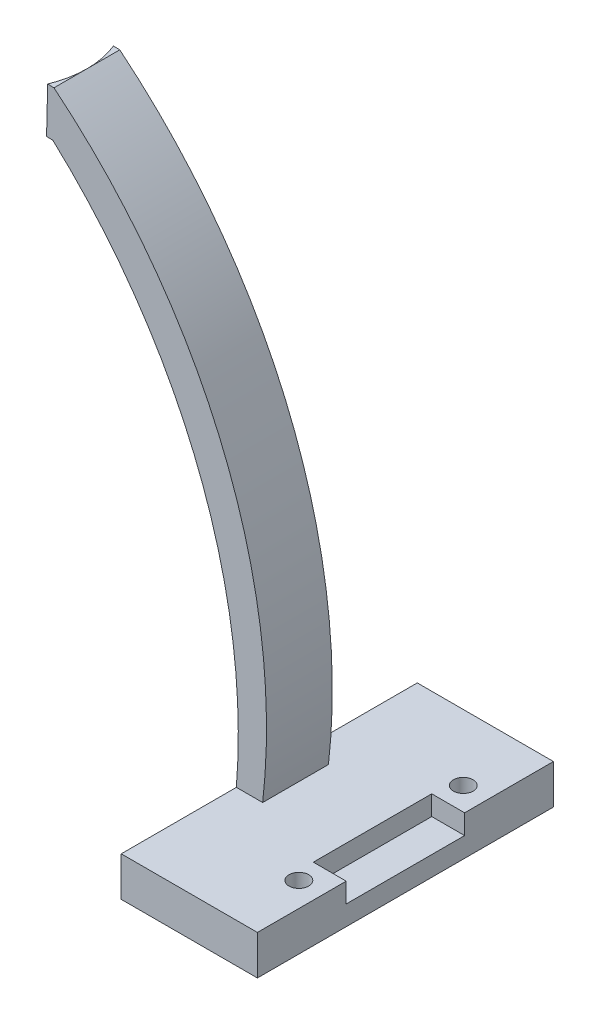
ISO-10303-21;
HEADER;
FILE_DESCRIPTION(('STEP AP214'),'2;1');
FILE_NAME('part.step','',(''),(''),'','','');
FILE_SCHEMA(('AUTOMOTIVE_DESIGN { 1 0 10303 214 1 1 1 1 }'));
ENDSEC;
DATA;
#1=APPLICATION_CONTEXT('core data for automotive mechanical design processes');
#2=APPLICATION_PROTOCOL_DEFINITION('international standard','automotive_design',2000,#1);
#3=PRODUCT_CONTEXT('',#1,'mechanical');
#4=PRODUCT('Part','Part','',(#3));
#5=PRODUCT_RELATED_PRODUCT_CATEGORY('part','',(#4));
#6=PRODUCT_DEFINITION_FORMATION('','',#4);
#7=PRODUCT_DEFINITION_CONTEXT('part definition',#1,'design');
#8=PRODUCT_DEFINITION('design','',#6,#7);
#9=PRODUCT_DEFINITION_SHAPE('','',#8);
#10=(LENGTH_UNIT() NAMED_UNIT(*) SI_UNIT(.MILLI.,.METRE.));
#11=(NAMED_UNIT(*) PLANE_ANGLE_UNIT() SI_UNIT($,.RADIAN.));
#12=(NAMED_UNIT(*) SI_UNIT($,.STERADIAN.) SOLID_ANGLE_UNIT());
#13=UNCERTAINTY_MEASURE_WITH_UNIT(LENGTH_MEASURE(1.E-05),#10,'distance_accuracy_value','');
#14=(GEOMETRIC_REPRESENTATION_CONTEXT(3) GLOBAL_UNCERTAINTY_ASSIGNED_CONTEXT((#13)) GLOBAL_UNIT_ASSIGNED_CONTEXT((#10,
#11,#12)) REPRESENTATION_CONTEXT('',''));
#15=CARTESIAN_POINT('',(0.,0.,0.));
#16=DIRECTION('',(0.,0.,1.));
#17=DIRECTION('',(1.,0.,0.));
#18=AXIS2_PLACEMENT_3D('',#15,#16,#17);
#19=CARTESIAN_POINT('',(-1.12144603022671,84.9599994250838,69.1592739234495));
#20=DIRECTION('',(0.999712398671277,-0.0239816584689477,0.));
#21=DIRECTION('',(0.0239816584689477,0.999712398671277,0.));
#22=AXIS2_PLACEMENT_3D('',#19,#20,#21);
#23=PLANE('',#22);
#24=DIRECTION('',(0.,0.,1.));
#25=VECTOR('',#24,1.);
#26=CARTESIAN_POINT('',(-1.28931763950938,77.9620126343849,59.1592739234495));
#27=LINE('',#26,#25);
#28=CARTESIAN_POINT('',(-1.28931763950934,77.9620126343849,59.1592739234495));
#29=VERTEX_POINT('',#28);
#30=CARTESIAN_POINT('',(-1.28931763950938,77.9620126343849,64.1592739234495));
#31=VERTEX_POINT('',#30);
#32=EDGE_CURVE('P0_E32',#29,#31,#27,.T.);
#33=ORIENTED_EDGE('',*,*,#32,.F.);
#34=DIRECTION('',(-0.0239816584689477,-0.999712398671277,0.));
#35=VECTOR('',#34,1.);
#36=CARTESIAN_POINT('',(-1.12144603022671,84.9599994250838,59.1592739234495));
#37=LINE('',#36,#35);
#38=CARTESIAN_POINT('',(-1.28936593349665,77.9599994250838,59.1592739234495));
#39=VERTEX_POINT('',#38);
#40=EDGE_CURVE('P0_E136',#29,#39,#37,.T.);
#41=ORIENTED_EDGE('',*,*,#40,.T.);
#42=DIRECTION('',(0.,0.,-1.));
#43=VECTOR('',#42,1.);
#44=CARTESIAN_POINT('',(-1.28936593349665,77.9599994250838,69.1592739234495));
#45=LINE('',#44,#43);
#46=CARTESIAN_POINT('',(-1.28936593349665,77.9599994250838,69.1592739234495));
#47=VERTEX_POINT('',#46);
#48=EDGE_CURVE('P0_E25',#47,#39,#45,.T.);
#49=ORIENTED_EDGE('',*,*,#48,.F.);
#50=DIRECTION('',(-0.0239816584689477,-0.999712398671277,0.));
#51=VECTOR('',#50,1.);
#52=CARTESIAN_POINT('',(-1.12144603022671,84.9599994250838,69.1592739234495));
#53=LINE('',#52,#51);
#54=CARTESIAN_POINT('',(-1.28931763950934,77.9620126343849,69.1592739234495));
#55=VERTEX_POINT('',#54);
#56=EDGE_CURVE('P0_E127',#55,#47,#53,.T.);
#57=ORIENTED_EDGE('',*,*,#56,.F.);
#58=DIRECTION('',(0.,0.,-1.));
#59=VECTOR('',#58,1.);
#60=CARTESIAN_POINT('',(-1.28931763950938,77.9620126343849,59.1592739234495));
#61=LINE('',#60,#59);
#62=EDGE_CURVE('P0_E39',#55,#31,#61,.T.);
#63=ORIENTED_EDGE('',*,*,#62,.T.);
#64=EDGE_LOOP('',(#33,#41,#49,#57,#63));
#65=FACE_BOUND('',#64,.T.);
#66=ADVANCED_FACE('P0_F17',(#65),#23,.F.);
#67=CARTESIAN_POINT('',(-56.8168251448185,16.8275934402524,69.1592739234495));
#68=DIRECTION('',(0.,0.,-1.));
#69=DIRECTION('',(-1.,0.,0.));
#70=AXIS2_PLACEMENT_3D('',#67,#68,#69);
#71=CYLINDRICAL_SURFACE('',#70,88.);
#72=CARTESIAN_POINT('',(-56.8168251448185,16.8275934402524,59.1592739234495));
#73=DIRECTION('',(0.,0.,1.));
#74=DIRECTION('',(-1.,0.,0.));
#75=AXIS2_PLACEMENT_3D('',#72,#73,#74);
#76=CIRCLE('',#75,88.);
#77=CARTESIAN_POINT('',(30.6019291079437,6.7299994250838,59.1592739234495));
#78=VERTEX_POINT('',#77);
#79=CARTESIAN_POINT('',(-1.12144603022671,84.9599994250838,59.1592739234495));
#80=VERTEX_POINT('',#79);
#81=EDGE_CURVE('P0_E123',#78,#80,#76,.T.);
#82=ORIENTED_EDGE('',*,*,#81,.T.);
#83=DIRECTION('',(0.,0.,1.));
#84=VECTOR('',#83,1.);
#85=CARTESIAN_POINT('',(-1.12144603022672,84.9599994250838,59.1592739234495));
#86=LINE('',#85,#84);
#87=CARTESIAN_POINT('',(-1.12144603022672,84.9599994250838,64.1592739234495));
#88=VERTEX_POINT('',#87);
#89=EDGE_CURVE('P0_E93',#80,#88,#86,.T.);
#90=ORIENTED_EDGE('',*,*,#89,.T.);
#91=DIRECTION('',(0.,0.,-1.));
#92=VECTOR('',#91,1.);
#93=CARTESIAN_POINT('',(-1.12144603022671,84.9599994250838,69.1592739234495));
#94=LINE('',#93,#92);
#95=CARTESIAN_POINT('',(-1.12144603022672,84.9599994250838,69.1592739234495));
#96=VERTEX_POINT('',#95);
#97=EDGE_CURVE('P0_E11',#96,#88,#94,.T.);
#98=ORIENTED_EDGE('',*,*,#97,.F.);
#99=CARTESIAN_POINT('',(-56.8168251448185,16.8275934402524,69.1592739234495));
#100=DIRECTION('',(0.,0.,1.));
#101=DIRECTION('',(-1.,0.,0.));
#102=AXIS2_PLACEMENT_3D('',#99,#100,#101);
#103=CIRCLE('',#102,88.);
#104=CARTESIAN_POINT('',(30.6019291079437,6.7299994250838,69.1592739234495));
#105=VERTEX_POINT('',#104);
#106=EDGE_CURVE('P0_E124',#105,#96,#103,.T.);
#107=ORIENTED_EDGE('',*,*,#106,.F.);
#108=DIRECTION('',(0.,0.,-1.));
#109=VECTOR('',#108,1.);
#110=CARTESIAN_POINT('',(30.6019291079437,6.7299994250838,69.1592739234495));
#111=LINE('',#110,#109);
#112=EDGE_CURVE('P0_E134',#105,#78,#111,.T.);
#113=ORIENTED_EDGE('',*,*,#112,.T.);
#114=EDGE_LOOP('',(#82,#90,#98,#107,#113));
#115=FACE_BOUND('',#114,.T.);
#116=ADVANCED_FACE('P0_F19',(#115),#71,.T.);
#117=CARTESIAN_POINT('',(-60.1059268398833,13.8537426076303,69.1592739234495));
#118=DIRECTION('',(0.,0.,-1.));
#119=DIRECTION('',(-1.,0.,0.));
#120=AXIS2_PLACEMENT_3D('',#117,#118,#119);
#121=CYLINDRICAL_SURFACE('',#120,87.);
#122=CARTESIAN_POINT('',(-60.1059268398833,13.8537426076303,59.1592739234495));
#123=DIRECTION('',(0.,0.,-1.));
#124=DIRECTION('',(-1.,0.,0.));
#125=AXIS2_PLACEMENT_3D('',#122,#123,#124);
#126=CIRCLE('',#125,87.);
#127=CARTESIAN_POINT('',(26.6019291079437,6.72999942508381,59.1592739234495));
#128=VERTEX_POINT('',#127);
#129=EDGE_CURVE('P0_E138',#39,#128,#126,.T.);
#130=ORIENTED_EDGE('',*,*,#129,.T.);
#131=DIRECTION('',(0.,0.,-1.));
#132=VECTOR('',#131,1.);
#133=CARTESIAN_POINT('',(26.6019291079437,6.72999942508381,69.1592739234495));
#134=LINE('',#133,#132);
#135=CARTESIAN_POINT('',(26.6019291079437,6.72999942508381,69.1592739234495));
#136=VERTEX_POINT('',#135);
#137=EDGE_CURVE('P0_E143',#136,#128,#134,.T.);
#138=ORIENTED_EDGE('',*,*,#137,.F.);
#139=CARTESIAN_POINT('',(-60.1059268398833,13.8537426076303,69.1592739234495));
#140=DIRECTION('',(0.,0.,-1.));
#141=DIRECTION('',(-1.,0.,0.));
#142=AXIS2_PLACEMENT_3D('',#139,#140,#141);
#143=CIRCLE('',#142,87.);
#144=EDGE_CURVE('P0_E130',#47,#136,#143,.T.);
#145=ORIENTED_EDGE('',*,*,#144,.F.);
#146=ORIENTED_EDGE('',*,*,#48,.T.);
#147=EDGE_LOOP('',(#130,#138,#145,#146));
#148=FACE_BOUND('',#147,.T.);
#149=ADVANCED_FACE('P0_F150',(#148),#121,.F.);
#150=CARTESIAN_POINT('',(26.6019291079437,6.7299994250838,69.1592739234495));
#151=DIRECTION('',(0.,1.,0.));
#152=DIRECTION('',(0.,0.,1.));
#153=AXIS2_PLACEMENT_3D('',#150,#151,#152);
#154=PLANE('',#153);
#155=DIRECTION('',(1.,0.,0.));
#156=VECTOR('',#155,1.);
#157=CARTESIAN_POINT('',(26.6019291079437,6.7299994250838,59.1592739234495));
#158=LINE('',#157,#156);
#159=EDGE_CURVE('P0_E128',#128,#78,#158,.T.);
#160=ORIENTED_EDGE('',*,*,#159,.T.);
#161=ORIENTED_EDGE('',*,*,#112,.F.);
#162=DIRECTION('',(1.,0.,0.));
#163=VECTOR('',#162,1.);
#164=CARTESIAN_POINT('',(26.6019291079437,6.7299994250838,69.1592739234495));
#165=LINE('',#164,#163);
#166=EDGE_CURVE('P0_E132',#136,#105,#165,.T.);
#167=ORIENTED_EDGE('',*,*,#166,.F.);
#168=ORIENTED_EDGE('',*,*,#137,.T.);
#169=EDGE_LOOP('',(#160,#161,#167,#168));
#170=FACE_BOUND('',#169,.T.);
#171=ADVANCED_FACE('P0_F156',(#170),#154,.F.);
#172=CARTESIAN_POINT('',(-56.8168251448185,16.8275934402524,69.1592739234495));
#173=DIRECTION('',(0.,0.,-1.));
#174=DIRECTION('',(-1.,0.,0.));
#175=AXIS2_PLACEMENT_3D('',#172,#173,#174);
#176=PLANE('',#175);
#177=ORIENTED_EDGE('',*,*,#106,.T.);
#178=DIRECTION('',(-0.999712398671277,0.023981658468951,0.));
#179=VECTOR('',#178,1.);
#180=CARTESIAN_POINT('',(18.4263968889922,84.4910748690651,69.1592739234495));
#181=LINE('',#180,#179);
#182=CARTESIAN_POINT('',(-2.08123371061888,84.9830233471483,69.1592739234495));
#183=VERTEX_POINT('',#182);
#184=EDGE_CURVE('P0_E107',#96,#183,#181,.T.);
#185=ORIENTED_EDGE('',*,*,#184,.T.);
#186=DIRECTION('',(0.0239816584689512,0.999712398671277,0.));
#187=VECTOR('',#186,1.);
#188=CARTESIAN_POINT('',(-2.24910531990154,77.9850365564494,69.1592739234495));
#189=LINE('',#188,#187);
#190=CARTESIAN_POINT('',(-2.24910531990154,77.9850365564494,69.1592739234495));
#191=VERTEX_POINT('',#190);
#192=EDGE_CURVE('P0_E119',#191,#183,#189,.T.);
#193=ORIENTED_EDGE('',*,*,#192,.F.);
#194=DIRECTION('',(-0.999712398671277,0.023981658468951,0.));
#195=VECTOR('',#194,1.);
#196=CARTESIAN_POINT('',(18.2585252797096,77.4930880783661,69.1592739234495));
#197=LINE('',#196,#195);
#198=EDGE_CURVE('P0_E117',#55,#191,#197,.T.);
#199=ORIENTED_EDGE('',*,*,#198,.F.);
#200=ORIENTED_EDGE('',*,*,#56,.T.);
#201=ORIENTED_EDGE('',*,*,#144,.T.);
#202=ORIENTED_EDGE('',*,*,#166,.T.);
#203=EDGE_LOOP('',(#177,#185,#193,#199,#200,#201,#202));
#204=FACE_BOUND('',#203,.T.);
#205=ADVANCED_FACE('P0_F162',(#204),#176,.F.);
#206=CARTESIAN_POINT('',(-56.8168251448185,16.8275934402524,59.1592739234495));
#207=DIRECTION('',(0.,0.,-1.));
#208=DIRECTION('',(-1.,0.,0.));
#209=AXIS2_PLACEMENT_3D('',#206,#207,#208);
#210=PLANE('',#209);
#211=ORIENTED_EDGE('',*,*,#81,.F.);
#212=ORIENTED_EDGE('',*,*,#159,.F.);
#213=ORIENTED_EDGE('',*,*,#129,.F.);
#214=ORIENTED_EDGE('',*,*,#40,.F.);
#215=DIRECTION('',(-0.999712398671277,0.023981658468951,0.));
#216=VECTOR('',#215,1.);
#217=CARTESIAN_POINT('',(18.2585252797096,77.4930880783661,59.1592739234495));
#218=LINE('',#217,#216);
#219=CARTESIAN_POINT('',(-2.24910531990154,77.9850365564493,59.1592739234495));
#220=VERTEX_POINT('',#219);
#221=EDGE_CURVE('P0_E90',#29,#220,#218,.T.);
#222=ORIENTED_EDGE('',*,*,#221,.T.);
#223=DIRECTION('',(0.0239816584689512,0.999712398671277,0.));
#224=VECTOR('',#223,1.);
#225=CARTESIAN_POINT('',(-2.24910531990154,77.9850365564493,59.1592739234495));
#226=LINE('',#225,#224);
#227=CARTESIAN_POINT('',(-2.08123371061888,84.9830233471483,59.1592739234495));
#228=VERTEX_POINT('',#227);
#229=EDGE_CURVE('P0_E83',#220,#228,#226,.T.);
#230=ORIENTED_EDGE('',*,*,#229,.T.);
#231=DIRECTION('',(-0.999712398671277,0.023981658468951,0.));
#232=VECTOR('',#231,1.);
#233=CARTESIAN_POINT('',(18.4263968889922,84.491074869065,59.1592739234495));
#234=LINE('',#233,#232);
#235=EDGE_CURVE('P0_E88',#80,#228,#234,.T.);
#236=ORIENTED_EDGE('',*,*,#235,.F.);
#237=EDGE_LOOP('',(#211,#212,#213,#214,#222,#230,#236));
#238=FACE_BOUND('',#237,.T.);
#239=ADVANCED_FACE('P0_F86',(#238),#210,.T.);
#240=CARTESIAN_POINT('',(-14.7854350215716,78.2857650237157,64.1592739234495));
#241=DIRECTION('',(0.0239816584689512,0.999712398671277,0.));
#242=DIRECTION('',(-0.999712398671277,0.0239816584689512,0.));
#243=AXIS2_PLACEMENT_3D('',#240,#241,#242);
#244=CYLINDRICAL_SURFACE('',#243,13.5);
#245=CARTESIAN_POINT('',(-14.617563412289,85.2837518144147,64.1592739234495));
#246=DIRECTION('',(0.023981658468951,0.999712398671277,0.));
#247=DIRECTION('',(-0.999712398671277,0.023981658468951,0.));
#248=AXIS2_PLACEMENT_3D('',#245,#246,#247);
#249=CIRCLE('',#248,13.5);
#250=EDGE_CURVE('P0_E101',#183,#88,#249,.T.);
#251=ORIENTED_EDGE('',*,*,#250,.T.);
#252=CARTESIAN_POINT('',(-14.617563412289,85.2837518144147,64.1592739234495));
#253=DIRECTION('',(0.023981658468951,0.999712398671277,0.));
#254=DIRECTION('',(-0.999712398671277,0.023981658468951,0.));
#255=AXIS2_PLACEMENT_3D('',#252,#253,#254);
#256=CIRCLE('',#255,13.5);
#257=EDGE_CURVE('P0_E97',#88,#228,#256,.T.);
#258=ORIENTED_EDGE('',*,*,#257,.T.);
#259=ORIENTED_EDGE('',*,*,#229,.F.);
#260=CARTESIAN_POINT('',(-14.7854350215716,78.2857650237157,64.1592739234495));
#261=DIRECTION('',(0.023981658468951,0.999712398671277,0.));
#262=DIRECTION('',(-0.999712398671277,0.023981658468951,0.));
#263=AXIS2_PLACEMENT_3D('',#260,#261,#262);
#264=CIRCLE('',#263,13.5);
#265=EDGE_CURVE('P0_E109',#31,#220,#264,.T.);
#266=ORIENTED_EDGE('',*,*,#265,.F.);
#267=CARTESIAN_POINT('',(-14.7854350215716,78.2857650237157,64.1592739234495));
#268=DIRECTION('',(0.023981658468951,0.999712398671277,0.));
#269=DIRECTION('',(-0.999712398671277,0.023981658468951,0.));
#270=AXIS2_PLACEMENT_3D('',#267,#268,#269);
#271=CIRCLE('',#270,13.5);
#272=EDGE_CURVE('P0_E115',#191,#31,#271,.T.);
#273=ORIENTED_EDGE('',*,*,#272,.F.);
#274=ORIENTED_EDGE('',*,*,#192,.T.);
#275=EDGE_LOOP('',(#251,#258,#259,#266,#273,#274));
#276=FACE_BOUND('',#275,.T.);
#277=ADVANCED_FACE('P0_F98',(#276),#244,.F.);
#278=CARTESIAN_POINT('',(18.2585252797096,77.4930880783661,59.1592739234495));
#279=DIRECTION('',(0.023981658468951,0.999712398671277,0.));
#280=DIRECTION('',(-0.999712398671277,0.023981658468951,0.));
#281=AXIS2_PLACEMENT_3D('',#278,#279,#280);
#282=PLANE('',#281);
#283=ORIENTED_EDGE('',*,*,#272,.T.);
#284=ORIENTED_EDGE('',*,*,#62,.F.);
#285=ORIENTED_EDGE('',*,*,#198,.T.);
#286=EDGE_LOOP('',(#283,#284,#285));
#287=FACE_BOUND('',#286,.T.);
#288=ADVANCED_FACE('P0_F167',(#287),#282,.F.);
#289=CARTESIAN_POINT('',(18.4263968889922,84.491074869065,59.1592739234495));
#290=DIRECTION('',(0.023981658468951,0.999712398671277,0.));
#291=DIRECTION('',(-0.999712398671277,0.023981658468951,0.));
#292=AXIS2_PLACEMENT_3D('',#289,#290,#291);
#293=PLANE('',#292);
#294=ORIENTED_EDGE('',*,*,#250,.F.);
#295=ORIENTED_EDGE('',*,*,#184,.F.);
#296=ORIENTED_EDGE('',*,*,#97,.T.);
#297=EDGE_LOOP('',(#294,#295,#296));
#298=FACE_BOUND('',#297,.T.);
#299=ADVANCED_FACE('P0_F169',(#298),#293,.T.);
#300=CARTESIAN_POINT('',(18.2585252797096,77.4930880783661,59.1592739234495));
#301=DIRECTION('',(0.023981658468951,0.999712398671277,0.));
#302=DIRECTION('',(-0.999712398671277,0.023981658468951,0.));
#303=AXIS2_PLACEMENT_3D('',#300,#301,#302);
#304=PLANE('',#303);
#305=ORIENTED_EDGE('',*,*,#265,.T.);
#306=ORIENTED_EDGE('',*,*,#221,.F.);
#307=ORIENTED_EDGE('',*,*,#32,.T.);
#308=EDGE_LOOP('',(#305,#306,#307));
#309=FACE_BOUND('',#308,.T.);
#310=ADVANCED_FACE('P0_F165',(#309),#304,.F.);
#311=CARTESIAN_POINT('',(18.4263968889922,84.491074869065,59.1592739234495));
#312=DIRECTION('',(0.023981658468951,0.999712398671277,0.));
#313=DIRECTION('',(-0.999712398671277,0.023981658468951,0.));
#314=AXIS2_PLACEMENT_3D('',#311,#312,#313);
#315=PLANE('',#314);
#316=ORIENTED_EDGE('',*,*,#257,.F.);
#317=ORIENTED_EDGE('',*,*,#89,.F.);
#318=ORIENTED_EDGE('',*,*,#235,.T.);
#319=EDGE_LOOP('',(#316,#317,#318));
#320=FACE_BOUND('',#319,.T.);
#321=ADVANCED_FACE('P0_F105',(#320),#315,.T.);
#322=CLOSED_SHELL('',(#66,#116,#149,#171,#205,#239,#277,#288,#299,#310,#321));
#323=MANIFOLD_SOLID_BREP('P0_B1',#322);
#324=CARTESIAN_POINT('',(35.0959219291765,6.7299994250838,60.1126597657247));
#325=DIRECTION('',(0.,1.,0.));
#326=DIRECTION('',(0.,0.,1.));
#327=AXIS2_PLACEMENT_3D('',#324,#325,#326);
#328=PLANE('',#327);
#329=DIRECTION('',(1.,0.,0.));
#330=VECTOR('',#329,1.);
#331=CARTESIAN_POINT('',(42.3019291079437,6.7299994250838,73.1592739234495));
#332=LINE('',#331,#330);
#333=CARTESIAN_POINT('',(42.3019291079437,6.7299994250838,73.1592739234495));
#334=VERTEX_POINT('',#333);
#335=CARTESIAN_POINT('',(47.3019291079437,6.7299994250838,73.1592739234495));
#336=VERTEX_POINT('',#335);
#337=EDGE_CURVE('P1_E106',#334,#336,#332,.T.);
#338=ORIENTED_EDGE('',*,*,#337,.F.);
#339=DIRECTION('',(0.,0.,1.));
#340=VECTOR('',#339,1.);
#341=CARTESIAN_POINT('',(42.3019291079437,6.7299994250838,55.1592739234495));
#342=LINE('',#341,#340);
#343=CARTESIAN_POINT('',(42.3019291079437,6.7299994250838,55.1592739234495));
#344=VERTEX_POINT('',#343);
#345=EDGE_CURVE('P1_E275',#344,#334,#342,.T.);
#346=ORIENTED_EDGE('',*,*,#345,.F.);
#347=DIRECTION('',(-1.,0.,0.));
#348=VECTOR('',#347,1.);
#349=CARTESIAN_POINT('',(47.3019291079437,6.7299994250838,55.1592739234495));
#350=LINE('',#349,#348);
#351=CARTESIAN_POINT('',(47.3019291079437,6.7299994250838,55.1592739234495));
#352=VERTEX_POINT('',#351);
#353=EDGE_CURVE('P1_E280',#352,#344,#350,.T.);
#354=ORIENTED_EDGE('',*,*,#353,.F.);
#355=DIRECTION('',(0.,0.,-1.));
#356=VECTOR('',#355,1.);
#357=CARTESIAN_POINT('',(47.3019291079437,6.7299994250838,86.6592739234495));
#358=LINE('',#357,#356);
#359=CARTESIAN_POINT('',(47.3019291079437,6.7299994250838,41.6592739234495));
#360=VERTEX_POINT('',#359);
#361=EDGE_CURVE('P1_E68',#352,#360,#358,.T.);
#362=ORIENTED_EDGE('',*,*,#361,.T.);
#363=DIRECTION('',(-1.,0.,0.));
#364=VECTOR('',#363,1.);
#365=CARTESIAN_POINT('',(47.3019291079437,6.7299994250838,41.6592739234495));
#366=LINE('',#365,#364);
#367=CARTESIAN_POINT('',(26.6019291079437,6.7299994250838,41.6592739234495));
#368=VERTEX_POINT('',#367);
#369=EDGE_CURVE('P1_E131',#360,#368,#366,.T.);
#370=ORIENTED_EDGE('',*,*,#369,.T.);
#371=DIRECTION('',(0.,0.,1.));
#372=VECTOR('',#371,1.);
#373=CARTESIAN_POINT('',(26.6019291079437,6.7299994250838,41.6592739234495));
#374=LINE('',#373,#372);
#375=CARTESIAN_POINT('',(26.6019291079437,6.7299994250838,86.6592739234495));
#376=VERTEX_POINT('',#375);
#377=EDGE_CURVE('P1_E133',#368,#376,#374,.T.);
#378=ORIENTED_EDGE('',*,*,#377,.T.);
#379=DIRECTION('',(1.,0.,0.));
#380=VECTOR('',#379,1.);
#381=CARTESIAN_POINT('',(26.6019291079437,6.7299994250838,86.6592739234495));
#382=LINE('',#381,#380);
#383=CARTESIAN_POINT('',(47.3019291079437,6.7299994250838,86.6592739234495));
#384=VERTEX_POINT('',#383);
#385=EDGE_CURVE('P1_E40',#376,#384,#382,.T.);
#386=ORIENTED_EDGE('',*,*,#385,.T.);
#387=EDGE_CURVE('P1_E129',#384,#336,#358,.T.);
#388=ORIENTED_EDGE('',*,*,#387,.T.);
#389=EDGE_LOOP('',(#338,#346,#354,#362,#370,#378,#386,#388));
#390=FACE_BOUND('',#389,.T.);
#391=CARTESIAN_POINT('',(43.6019291079437,6.7299994250838,76.6592739234495));
#392=DIRECTION('',(0.,1.,0.));
#393=DIRECTION('',(0.,0.,1.));
#394=AXIS2_PLACEMENT_3D('',#391,#392,#393);
#395=CIRCLE('',#394,1.5);
#396=CARTESIAN_POINT('',(43.6019291079437,6.7299994250838,78.1592739234495));
#397=VERTEX_POINT('',#396);
#398=EDGE_CURVE('P1_E123',#397,#397,#395,.T.);
#399=ORIENTED_EDGE('',*,*,#398,.F.);
#400=EDGE_LOOP('',(#399));
#401=FACE_BOUND('',#400,.T.);
#402=CARTESIAN_POINT('',(43.6019291079437,6.7299994250838,51.6592739234495));
#403=DIRECTION('',(0.,1.,0.));
#404=DIRECTION('',(0.,0.,1.));
#405=AXIS2_PLACEMENT_3D('',#402,#403,#404);
#406=CIRCLE('',#405,1.5);
#407=CARTESIAN_POINT('',(43.6019291079437,6.7299994250838,53.1592739234495));
#408=VERTEX_POINT('',#407);
#409=EDGE_CURVE('P1_E115',#408,#408,#406,.T.);
#410=ORIENTED_EDGE('',*,*,#409,.F.);
#411=EDGE_LOOP('',(#410));
#412=FACE_BOUND('',#411,.T.);
#413=ADVANCED_FACE('P1_F16',(#390,#401,#412),#328,.T.);
#414=CARTESIAN_POINT('',(35.0959219291765,0.729999425083802,60.1126597657247));
#415=DIRECTION('',(0.,1.,0.));
#416=DIRECTION('',(0.,0.,1.));
#417=AXIS2_PLACEMENT_3D('',#414,#415,#416);
#418=PLANE('',#417);
#419=DIRECTION('',(0.,0.,-1.));
#420=VECTOR('',#419,1.);
#421=CARTESIAN_POINT('',(47.3019291079437,0.729999425083802,86.6592739234495));
#422=LINE('',#421,#420);
#423=CARTESIAN_POINT('',(47.3019291079437,0.729999425083802,86.6592739234495));
#424=VERTEX_POINT('',#423);
#425=CARTESIAN_POINT('',(47.3019291079437,0.729999425083802,41.6592739234495));
#426=VERTEX_POINT('',#425);
#427=EDGE_CURVE('P1_E126',#424,#426,#422,.T.);
#428=ORIENTED_EDGE('',*,*,#427,.F.);
#429=DIRECTION('',(1.,0.,0.));
#430=VECTOR('',#429,1.);
#431=CARTESIAN_POINT('',(26.6019291079437,0.729999425083802,86.6592739234495));
#432=LINE('',#431,#430);
#433=CARTESIAN_POINT('',(26.6019291079437,0.729999425083802,86.6592739234495));
#434=VERTEX_POINT('',#433);
#435=EDGE_CURVE('P1_E61',#434,#424,#432,.T.);
#436=ORIENTED_EDGE('',*,*,#435,.F.);
#437=DIRECTION('',(0.,0.,1.));
#438=VECTOR('',#437,1.);
#439=CARTESIAN_POINT('',(26.6019291079437,0.729999425083802,41.6592739234495));
#440=LINE('',#439,#438);
#441=CARTESIAN_POINT('',(26.6019291079437,0.729999425083802,41.6592739234495));
#442=VERTEX_POINT('',#441);
#443=EDGE_CURVE('P1_E141',#442,#434,#440,.T.);
#444=ORIENTED_EDGE('',*,*,#443,.F.);
#445=DIRECTION('',(-1.,0.,0.));
#446=VECTOR('',#445,1.);
#447=CARTESIAN_POINT('',(47.3019291079437,0.729999425083802,41.6592739234495));
#448=LINE('',#447,#446);
#449=EDGE_CURVE('P1_E139',#426,#442,#448,.T.);
#450=ORIENTED_EDGE('',*,*,#449,.F.);
#451=EDGE_LOOP('',(#428,#436,#444,#450));
#452=FACE_BOUND('',#451,.T.);
#453=CARTESIAN_POINT('',(43.6019291079437,0.729999425083802,76.6592739234495));
#454=DIRECTION('',(0.,1.,0.));
#455=DIRECTION('',(0.,0.,1.));
#456=AXIS2_PLACEMENT_3D('',#453,#454,#455);
#457=CIRCLE('',#456,1.5);
#458=CARTESIAN_POINT('',(43.6019291079437,0.729999425083802,78.1592739234495));
#459=VERTEX_POINT('',#458);
#460=EDGE_CURVE('P1_E118',#459,#459,#457,.T.);
#461=ORIENTED_EDGE('',*,*,#460,.T.);
#462=EDGE_LOOP('',(#461));
#463=FACE_BOUND('',#462,.T.);
#464=CARTESIAN_POINT('',(43.6019291079437,0.729999425083802,51.6592739234495));
#465=DIRECTION('',(0.,1.,0.));
#466=DIRECTION('',(0.,0.,1.));
#467=AXIS2_PLACEMENT_3D('',#464,#465,#466);
#468=CIRCLE('',#467,1.5);
#469=CARTESIAN_POINT('',(43.6019291079437,0.729999425083802,53.1592739234495));
#470=VERTEX_POINT('',#469);
#471=EDGE_CURVE('P1_E119',#470,#470,#468,.T.);
#472=ORIENTED_EDGE('',*,*,#471,.T.);
#473=EDGE_LOOP('',(#472));
#474=FACE_BOUND('',#473,.T.);
#475=ADVANCED_FACE('P1_F156',(#452,#463,#474),#418,.F.);
#476=CARTESIAN_POINT('',(47.3019291079437,6.7299994250838,86.6592739234495));
#477=DIRECTION('',(-1.,0.,0.));
#478=DIRECTION('',(0.,0.,1.));
#479=AXIS2_PLACEMENT_3D('',#476,#477,#478);
#480=PLANE('',#479);
#481=DIRECTION('',(0.,0.,-1.));
#482=VECTOR('',#481,1.);
#483=CARTESIAN_POINT('',(47.3019291079437,3.7299994250838,73.1592739234495));
#484=LINE('',#483,#482);
#485=CARTESIAN_POINT('',(47.3019291079437,3.7299994250838,73.1592739234495));
#486=VERTEX_POINT('',#485);
#487=CARTESIAN_POINT('',(47.3019291079437,3.7299994250838,55.1592739234495));
#488=VERTEX_POINT('',#487);
#489=EDGE_CURVE('P1_E100',#486,#488,#484,.T.);
#490=ORIENTED_EDGE('',*,*,#489,.F.);
#491=DIRECTION('',(0.,1.,0.));
#492=VECTOR('',#491,1.);
#493=CARTESIAN_POINT('',(47.3019291079437,3.7299994250838,73.1592739234495));
#494=LINE('',#493,#492);
#495=EDGE_CURVE('P1_E122',#486,#336,#494,.T.);
#496=ORIENTED_EDGE('',*,*,#495,.T.);
#497=ORIENTED_EDGE('',*,*,#387,.F.);
#498=DIRECTION('',(0.,-1.,0.));
#499=VECTOR('',#498,1.);
#500=CARTESIAN_POINT('',(47.3019291079437,6.7299994250838,86.6592739234495));
#501=LINE('',#500,#499);
#502=EDGE_CURVE('P1_E136',#384,#424,#501,.T.);
#503=ORIENTED_EDGE('',*,*,#502,.T.);
#504=ORIENTED_EDGE('',*,*,#427,.T.);
#505=DIRECTION('',(0.,-1.,0.));
#506=VECTOR('',#505,1.);
#507=CARTESIAN_POINT('',(47.3019291079437,6.7299994250838,41.6592739234495));
#508=LINE('',#507,#506);
#509=EDGE_CURVE('P1_E10',#360,#426,#508,.T.);
#510=ORIENTED_EDGE('',*,*,#509,.F.);
#511=ORIENTED_EDGE('',*,*,#361,.F.);
#512=DIRECTION('',(0.,1.,0.));
#513=VECTOR('',#512,1.);
#514=CARTESIAN_POINT('',(47.3019291079437,3.7299994250838,55.1592739234495));
#515=LINE('',#514,#513);
#516=EDGE_CURVE('P1_E96',#488,#352,#515,.T.);
#517=ORIENTED_EDGE('',*,*,#516,.F.);
#518=EDGE_LOOP('',(#490,#496,#497,#503,#504,#510,#511,#517));
#519=FACE_BOUND('',#518,.T.);
#520=ADVANCED_FACE('P1_F18',(#519),#480,.F.);
#521=CARTESIAN_POINT('',(47.3019291079437,6.7299994250838,41.6592739234495));
#522=DIRECTION('',(0.,0.,1.));
#523=DIRECTION('',(0.,-1.,0.));
#524=AXIS2_PLACEMENT_3D('',#521,#522,#523);
#525=PLANE('',#524);
#526=ORIENTED_EDGE('',*,*,#449,.T.);
#527=DIRECTION('',(0.,-1.,0.));
#528=VECTOR('',#527,1.);
#529=CARTESIAN_POINT('',(26.6019291079437,6.7299994250838,41.6592739234495));
#530=LINE('',#529,#528);
#531=EDGE_CURVE('P1_E24',#368,#442,#530,.T.);
#532=ORIENTED_EDGE('',*,*,#531,.F.);
#533=ORIENTED_EDGE('',*,*,#369,.F.);
#534=ORIENTED_EDGE('',*,*,#509,.T.);
#535=EDGE_LOOP('',(#526,#532,#533,#534));
#536=FACE_BOUND('',#535,.T.);
#537=ADVANCED_FACE('P1_F171',(#536),#525,.F.);
#538=CARTESIAN_POINT('',(26.6019291079437,6.7299994250838,41.6592739234495));
#539=DIRECTION('',(1.,0.,0.));
#540=DIRECTION('',(0.,1.,0.));
#541=AXIS2_PLACEMENT_3D('',#538,#539,#540);
#542=PLANE('',#541);
#543=ORIENTED_EDGE('',*,*,#443,.T.);
#544=DIRECTION('',(0.,-1.,0.));
#545=VECTOR('',#544,1.);
#546=CARTESIAN_POINT('',(26.6019291079437,6.7299994250838,86.6592739234495));
#547=LINE('',#546,#545);
#548=EDGE_CURVE('P1_E145',#376,#434,#547,.T.);
#549=ORIENTED_EDGE('',*,*,#548,.F.);
#550=ORIENTED_EDGE('',*,*,#377,.F.);
#551=ORIENTED_EDGE('',*,*,#531,.T.);
#552=EDGE_LOOP('',(#543,#549,#550,#551));
#553=FACE_BOUND('',#552,.T.);
#554=ADVANCED_FACE('P1_F151',(#553),#542,.F.);
#555=CARTESIAN_POINT('',(26.6019291079437,6.7299994250838,86.6592739234495));
#556=DIRECTION('',(0.,0.,-1.));
#557=DIRECTION('',(0.,1.,0.));
#558=AXIS2_PLACEMENT_3D('',#555,#556,#557);
#559=PLANE('',#558);
#560=ORIENTED_EDGE('',*,*,#435,.T.);
#561=ORIENTED_EDGE('',*,*,#502,.F.);
#562=ORIENTED_EDGE('',*,*,#385,.F.);
#563=ORIENTED_EDGE('',*,*,#548,.T.);
#564=EDGE_LOOP('',(#560,#561,#562,#563));
#565=FACE_BOUND('',#564,.T.);
#566=ADVANCED_FACE('P1_F159',(#565),#559,.F.);
#567=CARTESIAN_POINT('',(43.6019291079437,6.7299994250838,76.6592739234495));
#568=DIRECTION('',(0.,-1.,0.));
#569=DIRECTION('',(0.,0.,-1.));
#570=AXIS2_PLACEMENT_3D('',#567,#568,#569);
#571=CYLINDRICAL_SURFACE('',#570,1.5);
#572=ORIENTED_EDGE('',*,*,#398,.T.);
#573=EDGE_LOOP('',(#572));
#574=FACE_BOUND('',#573,.T.);
#575=ORIENTED_EDGE('',*,*,#460,.F.);
#576=EDGE_LOOP('',(#575));
#577=FACE_BOUND('',#576,.T.);
#578=ADVANCED_FACE('P1_F161',(#574,#577),#571,.F.);
#579=CARTESIAN_POINT('',(43.6019291079437,6.7299994250838,51.6592739234495));
#580=DIRECTION('',(0.,-1.,0.));
#581=DIRECTION('',(0.,0.,-1.));
#582=AXIS2_PLACEMENT_3D('',#579,#580,#581);
#583=CYLINDRICAL_SURFACE('',#582,1.5);
#584=ORIENTED_EDGE('',*,*,#409,.T.);
#585=EDGE_LOOP('',(#584));
#586=FACE_BOUND('',#585,.T.);
#587=ORIENTED_EDGE('',*,*,#471,.F.);
#588=EDGE_LOOP('',(#587));
#589=FACE_BOUND('',#588,.T.);
#590=ADVANCED_FACE('P1_F168',(#586,#589),#583,.F.);
#591=CARTESIAN_POINT('',(42.3019291079437,3.7299994250838,73.1592739234495));
#592=DIRECTION('',(0.,0.,1.));
#593=DIRECTION('',(1.,0.,0.));
#594=AXIS2_PLACEMENT_3D('',#591,#592,#593);
#595=PLANE('',#594);
#596=ORIENTED_EDGE('',*,*,#337,.T.);
#597=ORIENTED_EDGE('',*,*,#495,.F.);
#598=DIRECTION('',(1.,0.,0.));
#599=VECTOR('',#598,1.);
#600=CARTESIAN_POINT('',(42.3019291079437,3.7299994250838,73.1592739234495));
#601=LINE('',#600,#599);
#602=CARTESIAN_POINT('',(42.3019291079437,3.7299994250838,73.1592739234495));
#603=VERTEX_POINT('',#602);
#604=EDGE_CURVE('P1_E31',#603,#486,#601,.T.);
#605=ORIENTED_EDGE('',*,*,#604,.F.);
#606=DIRECTION('',(0.,1.,0.));
#607=VECTOR('',#606,1.);
#608=CARTESIAN_POINT('',(42.3019291079437,3.7299994250838,73.1592739234495));
#609=LINE('',#608,#607);
#610=EDGE_CURVE('P1_E110',#603,#334,#609,.T.);
#611=ORIENTED_EDGE('',*,*,#610,.T.);
#612=EDGE_LOOP('',(#596,#597,#605,#611));
#613=FACE_BOUND('',#612,.T.);
#614=ADVANCED_FACE('P1_F184',(#613),#595,.F.);
#615=CARTESIAN_POINT('',(42.3019291079437,3.7299994250838,55.1592739234495));
#616=DIRECTION('',(-1.,0.,0.));
#617=DIRECTION('',(0.,-1.,0.));
#618=AXIS2_PLACEMENT_3D('',#615,#616,#617);
#619=PLANE('',#618);
#620=ORIENTED_EDGE('',*,*,#345,.T.);
#621=ORIENTED_EDGE('',*,*,#610,.F.);
#622=DIRECTION('',(0.,0.,1.));
#623=VECTOR('',#622,1.);
#624=CARTESIAN_POINT('',(42.3019291079437,3.7299994250838,55.1592739234495));
#625=LINE('',#624,#623);
#626=CARTESIAN_POINT('',(42.3019291079437,3.7299994250838,55.1592739234495));
#627=VERTEX_POINT('',#626);
#628=EDGE_CURVE('P1_E99',#627,#603,#625,.T.);
#629=ORIENTED_EDGE('',*,*,#628,.F.);
#630=DIRECTION('',(0.,1.,0.));
#631=VECTOR('',#630,1.);
#632=CARTESIAN_POINT('',(42.3019291079437,3.7299994250838,55.1592739234495));
#633=LINE('',#632,#631);
#634=EDGE_CURVE('P1_E97',#627,#344,#633,.T.);
#635=ORIENTED_EDGE('',*,*,#634,.T.);
#636=EDGE_LOOP('',(#620,#621,#629,#635));
#637=FACE_BOUND('',#636,.T.);
#638=ADVANCED_FACE('P1_F188',(#637),#619,.F.);
#639=CARTESIAN_POINT('',(47.3019291079437,3.7299994250838,55.1592739234495));
#640=DIRECTION('',(0.,0.,-1.));
#641=DIRECTION('',(-1.,0.,0.));
#642=AXIS2_PLACEMENT_3D('',#639,#640,#641);
#643=PLANE('',#642);
#644=ORIENTED_EDGE('',*,*,#353,.T.);
#645=ORIENTED_EDGE('',*,*,#634,.F.);
#646=DIRECTION('',(-1.,0.,0.));
#647=VECTOR('',#646,1.);
#648=CARTESIAN_POINT('',(47.3019291079437,3.7299994250838,55.1592739234495));
#649=LINE('',#648,#647);
#650=EDGE_CURVE('P1_E92',#488,#627,#649,.T.);
#651=ORIENTED_EDGE('',*,*,#650,.F.);
#652=ORIENTED_EDGE('',*,*,#516,.T.);
#653=EDGE_LOOP('',(#644,#645,#651,#652));
#654=FACE_BOUND('',#653,.T.);
#655=ADVANCED_FACE('P1_F94',(#654),#643,.F.);
#656=CARTESIAN_POINT('',(35.0959219291765,3.7299994250838,60.1126597657247));
#657=DIRECTION('',(0.,1.,0.));
#658=DIRECTION('',(0.,0.,1.));
#659=AXIS2_PLACEMENT_3D('',#656,#657,#658);
#660=PLANE('',#659);
#661=ORIENTED_EDGE('',*,*,#489,.T.);
#662=ORIENTED_EDGE('',*,*,#650,.T.);
#663=ORIENTED_EDGE('',*,*,#628,.T.);
#664=ORIENTED_EDGE('',*,*,#604,.T.);
#665=EDGE_LOOP('',(#661,#662,#663,#664));
#666=FACE_BOUND('',#665,.T.);
#667=ADVANCED_FACE('P1_F103',(#666),#660,.T.);
#668=CLOSED_SHELL('',(#413,#475,#520,#537,#554,#566,#578,#590,#614,#638,#655,#667));
#669=MANIFOLD_SOLID_BREP('P1_B1',#668);
#670=ADVANCED_BREP_SHAPE_REPRESENTATION('',(#18,#323,#669),#14);
#671=SHAPE_DEFINITION_REPRESENTATION(#9,#670);
ENDSEC;
END-ISO-10303-21;
